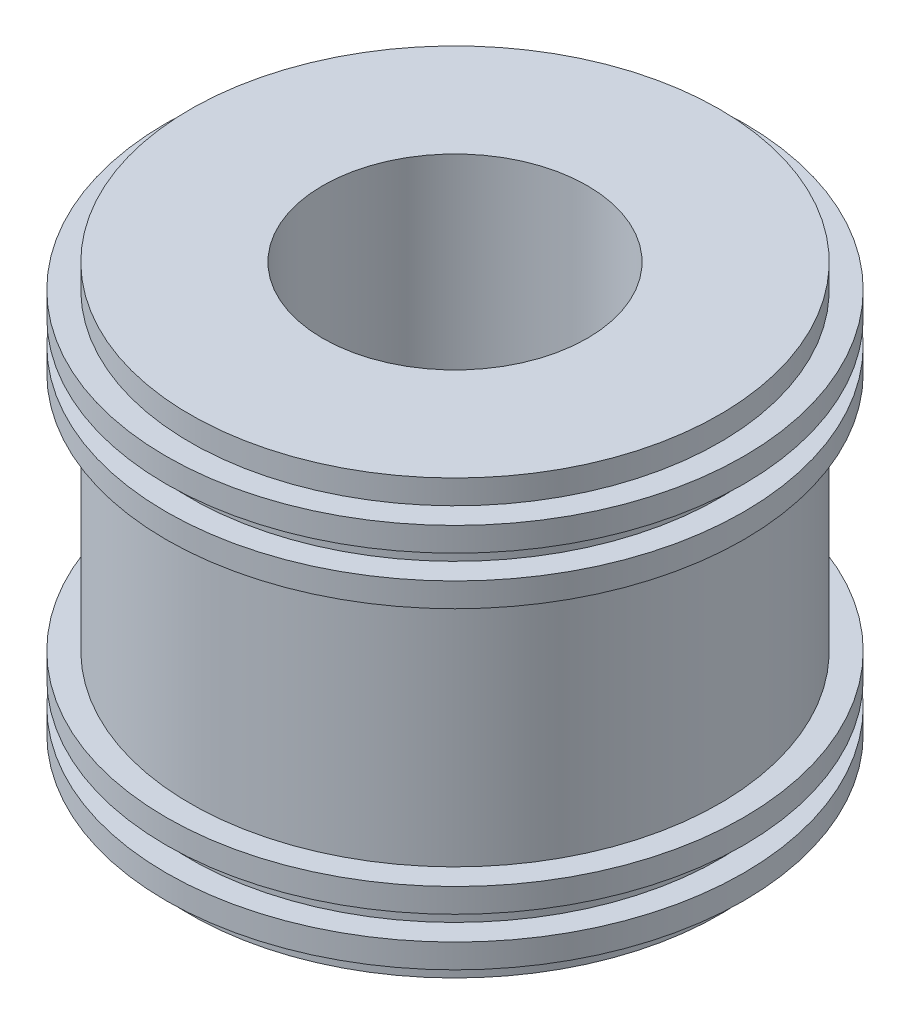
ISO-10303-21;
HEADER;
FILE_DESCRIPTION(('STEP AP214'),'2;1');
FILE_NAME('part.step','',(''),(''),'','','');
FILE_SCHEMA(('AUTOMOTIVE_DESIGN { 1 0 10303 214 1 1 1 1 }'));
ENDSEC;
DATA;
#1=APPLICATION_CONTEXT('core data for automotive mechanical design processes');
#2=APPLICATION_PROTOCOL_DEFINITION('international standard','automotive_design',2000,#1);
#3=PRODUCT_CONTEXT('',#1,'mechanical');
#4=PRODUCT('Part','Part','',(#3));
#5=PRODUCT_RELATED_PRODUCT_CATEGORY('part','',(#4));
#6=PRODUCT_DEFINITION_FORMATION('','',#4);
#7=PRODUCT_DEFINITION_CONTEXT('part definition',#1,'design');
#8=PRODUCT_DEFINITION('design','',#6,#7);
#9=PRODUCT_DEFINITION_SHAPE('','',#8);
#10=(LENGTH_UNIT() NAMED_UNIT(*) SI_UNIT(.MILLI.,.METRE.));
#11=(NAMED_UNIT(*) PLANE_ANGLE_UNIT() SI_UNIT($,.RADIAN.));
#12=(NAMED_UNIT(*) SI_UNIT($,.STERADIAN.) SOLID_ANGLE_UNIT());
#13=UNCERTAINTY_MEASURE_WITH_UNIT(LENGTH_MEASURE(1.E-05),#10,'distance_accuracy_value','');
#14=(GEOMETRIC_REPRESENTATION_CONTEXT(3) GLOBAL_UNCERTAINTY_ASSIGNED_CONTEXT((#13)) GLOBAL_UNIT_ASSIGNED_CONTEXT((#10,
#11,#12)) REPRESENTATION_CONTEXT('',''));
#15=CARTESIAN_POINT('',(0.,0.,0.));
#16=DIRECTION('',(0.,0.,1.));
#17=DIRECTION('',(1.,0.,0.));
#18=AXIS2_PLACEMENT_3D('',#15,#16,#17);
#19=CARTESIAN_POINT('',(24.,-16.,0.));
#20=DIRECTION('',(0.,-1.,0.));
#21=DIRECTION('',(0.,0.,-1.));
#22=AXIS2_PLACEMENT_3D('',#19,#20,#21);
#23=PLANE('',#22);
#24=CARTESIAN_POINT('',(0.,-16.,0.));
#25=DIRECTION('',(0.,-1.,0.));
#26=DIRECTION('',(0.,0.,-1.));
#27=AXIS2_PLACEMENT_3D('',#24,#25,#26);
#28=CIRCLE('',#27,24.);
#29=CARTESIAN_POINT('',(0.,-16.,-24.));
#30=VERTEX_POINT('',#29);
#31=EDGE_CURVE('E10',#30,#30,#28,.T.);
#32=ORIENTED_EDGE('',*,*,#31,.T.);
#33=EDGE_LOOP('',(#32));
#34=FACE_BOUND('',#33,.T.);
#35=CARTESIAN_POINT('',(0.,-16.,0.));
#36=DIRECTION('',(0.,-1.,0.));
#37=DIRECTION('',(0.,0.,-1.));
#38=AXIS2_PLACEMENT_3D('',#35,#36,#37);
#39=CIRCLE('',#38,22.);
#40=CARTESIAN_POINT('',(0.,-16.,-22.));
#41=VERTEX_POINT('',#40);
#42=EDGE_CURVE('E95',#41,#41,#39,.T.);
#43=ORIENTED_EDGE('',*,*,#42,.F.);
#44=EDGE_LOOP('',(#43));
#45=FACE_BOUND('',#44,.T.);
#46=ADVANCED_FACE('F31',(#34,#45),#23,.T.);
#47=CARTESIAN_POINT('',(0.,0.,0.));
#48=DIRECTION('',(0.,-1.,0.));
#49=DIRECTION('',(0.,0.,-1.));
#50=AXIS2_PLACEMENT_3D('',#47,#48,#49);
#51=CYLINDRICAL_SURFACE('',#50,24.);
#52=CARTESIAN_POINT('',(0.,-14.,0.));
#53=DIRECTION('',(0.,-1.,0.));
#54=DIRECTION('',(0.,0.,-1.));
#55=AXIS2_PLACEMENT_3D('',#52,#53,#54);
#56=CIRCLE('',#55,24.);
#57=CARTESIAN_POINT('',(0.,-14.,-24.));
#58=VERTEX_POINT('',#57);
#59=EDGE_CURVE('E37',#58,#58,#56,.T.);
#60=ORIENTED_EDGE('',*,*,#59,.T.);
#61=EDGE_LOOP('',(#60));
#62=FACE_BOUND('',#61,.T.);
#63=ORIENTED_EDGE('',*,*,#31,.F.);
#64=EDGE_LOOP('',(#63));
#65=FACE_BOUND('',#64,.T.);
#66=ADVANCED_FACE('F103',(#62,#65),#51,.T.);
#67=CARTESIAN_POINT('',(22.,-14.,0.));
#68=DIRECTION('',(0.,1.,0.));
#69=DIRECTION('',(0.,0.,1.));
#70=AXIS2_PLACEMENT_3D('',#67,#68,#69);
#71=PLANE('',#70);
#72=CARTESIAN_POINT('',(0.,-14.,0.));
#73=DIRECTION('',(0.,-1.,0.));
#74=DIRECTION('',(0.,0.,-1.));
#75=AXIS2_PLACEMENT_3D('',#72,#73,#74);
#76=CIRCLE('',#75,22.);
#77=CARTESIAN_POINT('',(0.,-14.,-22.));
#78=VERTEX_POINT('',#77);
#79=EDGE_CURVE('E41',#78,#78,#76,.T.);
#80=ORIENTED_EDGE('',*,*,#79,.T.);
#81=EDGE_LOOP('',(#80));
#82=FACE_BOUND('',#81,.T.);
#83=ORIENTED_EDGE('',*,*,#59,.F.);
#84=EDGE_LOOP('',(#83));
#85=FACE_BOUND('',#84,.T.);
#86=ADVANCED_FACE('F107',(#82,#85),#71,.T.);
#87=CARTESIAN_POINT('',(0.,0.,0.));
#88=DIRECTION('',(0.,-1.,0.));
#89=DIRECTION('',(0.,0.,-1.));
#90=AXIS2_PLACEMENT_3D('',#87,#88,#89);
#91=CYLINDRICAL_SURFACE('',#90,22.);
#92=CARTESIAN_POINT('',(0.,-12.,0.));
#93=DIRECTION('',(0.,-1.,0.));
#94=DIRECTION('',(0.,0.,-1.));
#95=AXIS2_PLACEMENT_3D('',#92,#93,#94);
#96=CIRCLE('',#95,22.);
#97=CARTESIAN_POINT('',(0.,-12.,-22.));
#98=VERTEX_POINT('',#97);
#99=EDGE_CURVE('E45',#98,#98,#96,.T.);
#100=ORIENTED_EDGE('',*,*,#99,.T.);
#101=EDGE_LOOP('',(#100));
#102=FACE_BOUND('',#101,.T.);
#103=ORIENTED_EDGE('',*,*,#79,.F.);
#104=EDGE_LOOP('',(#103));
#105=FACE_BOUND('',#104,.T.);
#106=ADVANCED_FACE('F111',(#102,#105),#91,.T.);
#107=CARTESIAN_POINT('',(22.,-12.,0.));
#108=DIRECTION('',(0.,-1.,0.));
#109=DIRECTION('',(0.,0.,-1.));
#110=AXIS2_PLACEMENT_3D('',#107,#108,#109);
#111=PLANE('',#110);
#112=CARTESIAN_POINT('',(0.,-12.,0.));
#113=DIRECTION('',(0.,-1.,0.));
#114=DIRECTION('',(0.,0.,-1.));
#115=AXIS2_PLACEMENT_3D('',#112,#113,#114);
#116=CIRCLE('',#115,24.);
#117=CARTESIAN_POINT('',(0.,-12.,-24.));
#118=VERTEX_POINT('',#117);
#119=EDGE_CURVE('E50',#118,#118,#116,.T.);
#120=ORIENTED_EDGE('',*,*,#119,.T.);
#121=EDGE_LOOP('',(#120));
#122=FACE_BOUND('',#121,.T.);
#123=ORIENTED_EDGE('',*,*,#99,.F.);
#124=EDGE_LOOP('',(#123));
#125=FACE_BOUND('',#124,.T.);
#126=ADVANCED_FACE('F118',(#122,#125),#111,.T.);
#127=CARTESIAN_POINT('',(0.,0.,0.));
#128=DIRECTION('',(0.,-1.,0.));
#129=DIRECTION('',(0.,0.,-1.));
#130=AXIS2_PLACEMENT_3D('',#127,#128,#129);
#131=CYLINDRICAL_SURFACE('',#130,24.);
#132=CARTESIAN_POINT('',(0.,-9.99999999999999,0.));
#133=DIRECTION('',(0.,-1.,0.));
#134=DIRECTION('',(0.,0.,-1.));
#135=AXIS2_PLACEMENT_3D('',#132,#133,#134);
#136=CIRCLE('',#135,24.);
#137=CARTESIAN_POINT('',(0.,-9.99999999999999,-24.));
#138=VERTEX_POINT('',#137);
#139=EDGE_CURVE('E53',#138,#138,#136,.T.);
#140=ORIENTED_EDGE('',*,*,#139,.T.);
#141=EDGE_LOOP('',(#140));
#142=FACE_BOUND('',#141,.T.);
#143=ORIENTED_EDGE('',*,*,#119,.F.);
#144=EDGE_LOOP('',(#143));
#145=FACE_BOUND('',#144,.T.);
#146=ADVANCED_FACE('F122',(#142,#145),#131,.T.);
#147=CARTESIAN_POINT('',(24.,-9.99999999999999,0.));
#148=DIRECTION('',(0.,1.,0.));
#149=DIRECTION('',(0.,0.,1.));
#150=AXIS2_PLACEMENT_3D('',#147,#148,#149);
#151=PLANE('',#150);
#152=CARTESIAN_POINT('',(0.,-9.99999999999999,0.));
#153=DIRECTION('',(0.,-1.,0.));
#154=DIRECTION('',(0.,0.,-1.));
#155=AXIS2_PLACEMENT_3D('',#152,#153,#154);
#156=CIRCLE('',#155,22.);
#157=CARTESIAN_POINT('',(0.,-9.99999999999999,-22.));
#158=VERTEX_POINT('',#157);
#159=EDGE_CURVE('E56',#158,#158,#156,.T.);
#160=ORIENTED_EDGE('',*,*,#159,.T.);
#161=EDGE_LOOP('',(#160));
#162=FACE_BOUND('',#161,.T.);
#163=ORIENTED_EDGE('',*,*,#139,.F.);
#164=EDGE_LOOP('',(#163));
#165=FACE_BOUND('',#164,.T.);
#166=ADVANCED_FACE('F126',(#162,#165),#151,.T.);
#167=CARTESIAN_POINT('',(0.,0.,0.));
#168=DIRECTION('',(0.,-1.,0.));
#169=DIRECTION('',(0.,0.,-1.));
#170=AXIS2_PLACEMENT_3D('',#167,#168,#169);
#171=CYLINDRICAL_SURFACE('',#170,22.);
#172=CARTESIAN_POINT('',(0.,9.99999999999999,0.));
#173=DIRECTION('',(0.,-1.,0.));
#174=DIRECTION('',(0.,0.,-1.));
#175=AXIS2_PLACEMENT_3D('',#172,#173,#174);
#176=CIRCLE('',#175,22.);
#177=CARTESIAN_POINT('',(0.,9.99999999999999,-22.));
#178=VERTEX_POINT('',#177);
#179=EDGE_CURVE('E59',#178,#178,#176,.T.);
#180=ORIENTED_EDGE('',*,*,#179,.T.);
#181=EDGE_LOOP('',(#180));
#182=FACE_BOUND('',#181,.T.);
#183=ORIENTED_EDGE('',*,*,#159,.F.);
#184=EDGE_LOOP('',(#183));
#185=FACE_BOUND('',#184,.T.);
#186=ADVANCED_FACE('F130',(#182,#185),#171,.T.);
#187=CARTESIAN_POINT('',(24.,9.99999999999999,0.));
#188=DIRECTION('',(0.,-1.,0.));
#189=DIRECTION('',(0.,0.,-1.));
#190=AXIS2_PLACEMENT_3D('',#187,#188,#189);
#191=PLANE('',#190);
#192=CARTESIAN_POINT('',(0.,9.99999999999999,0.));
#193=DIRECTION('',(0.,-1.,0.));
#194=DIRECTION('',(0.,0.,-1.));
#195=AXIS2_PLACEMENT_3D('',#192,#193,#194);
#196=CIRCLE('',#195,24.);
#197=CARTESIAN_POINT('',(0.,9.99999999999999,-24.));
#198=VERTEX_POINT('',#197);
#199=EDGE_CURVE('E62',#198,#198,#196,.T.);
#200=ORIENTED_EDGE('',*,*,#199,.T.);
#201=EDGE_LOOP('',(#200));
#202=FACE_BOUND('',#201,.T.);
#203=ORIENTED_EDGE('',*,*,#179,.F.);
#204=EDGE_LOOP('',(#203));
#205=FACE_BOUND('',#204,.T.);
#206=ADVANCED_FACE('F134',(#202,#205),#191,.T.);
#207=CARTESIAN_POINT('',(0.,0.,0.));
#208=DIRECTION('',(0.,-1.,0.));
#209=DIRECTION('',(0.,0.,-1.));
#210=AXIS2_PLACEMENT_3D('',#207,#208,#209);
#211=CYLINDRICAL_SURFACE('',#210,24.);
#212=CARTESIAN_POINT('',(0.,12.,0.));
#213=DIRECTION('',(0.,-1.,0.));
#214=DIRECTION('',(0.,0.,-1.));
#215=AXIS2_PLACEMENT_3D('',#212,#213,#214);
#216=CIRCLE('',#215,24.);
#217=CARTESIAN_POINT('',(0.,12.,-24.));
#218=VERTEX_POINT('',#217);
#219=EDGE_CURVE('E65',#218,#218,#216,.T.);
#220=ORIENTED_EDGE('',*,*,#219,.T.);
#221=EDGE_LOOP('',(#220));
#222=FACE_BOUND('',#221,.T.);
#223=ORIENTED_EDGE('',*,*,#199,.F.);
#224=EDGE_LOOP('',(#223));
#225=FACE_BOUND('',#224,.T.);
#226=ADVANCED_FACE('F138',(#222,#225),#211,.T.);
#227=CARTESIAN_POINT('',(22.,12.,0.));
#228=DIRECTION('',(0.,1.,0.));
#229=DIRECTION('',(0.,0.,1.));
#230=AXIS2_PLACEMENT_3D('',#227,#228,#229);
#231=PLANE('',#230);
#232=CARTESIAN_POINT('',(0.,12.,0.));
#233=DIRECTION('',(0.,-1.,0.));
#234=DIRECTION('',(0.,0.,-1.));
#235=AXIS2_PLACEMENT_3D('',#232,#233,#234);
#236=CIRCLE('',#235,22.);
#237=CARTESIAN_POINT('',(0.,12.,-22.));
#238=VERTEX_POINT('',#237);
#239=EDGE_CURVE('E68',#238,#238,#236,.T.);
#240=ORIENTED_EDGE('',*,*,#239,.T.);
#241=EDGE_LOOP('',(#240));
#242=FACE_BOUND('',#241,.T.);
#243=ORIENTED_EDGE('',*,*,#219,.F.);
#244=EDGE_LOOP('',(#243));
#245=FACE_BOUND('',#244,.T.);
#246=ADVANCED_FACE('F142',(#242,#245),#231,.T.);
#247=CARTESIAN_POINT('',(0.,0.,0.));
#248=DIRECTION('',(0.,-1.,0.));
#249=DIRECTION('',(0.,0.,-1.));
#250=AXIS2_PLACEMENT_3D('',#247,#248,#249);
#251=CYLINDRICAL_SURFACE('',#250,22.);
#252=CARTESIAN_POINT('',(0.,14.,0.));
#253=DIRECTION('',(0.,-1.,0.));
#254=DIRECTION('',(0.,0.,-1.));
#255=AXIS2_PLACEMENT_3D('',#252,#253,#254);
#256=CIRCLE('',#255,22.);
#257=CARTESIAN_POINT('',(0.,14.,-22.));
#258=VERTEX_POINT('',#257);
#259=EDGE_CURVE('E71',#258,#258,#256,.T.);
#260=ORIENTED_EDGE('',*,*,#259,.T.);
#261=EDGE_LOOP('',(#260));
#262=FACE_BOUND('',#261,.T.);
#263=ORIENTED_EDGE('',*,*,#239,.F.);
#264=EDGE_LOOP('',(#263));
#265=FACE_BOUND('',#264,.T.);
#266=ADVANCED_FACE('F146',(#262,#265),#251,.T.);
#267=CARTESIAN_POINT('',(22.,14.,0.));
#268=DIRECTION('',(0.,-1.,0.));
#269=DIRECTION('',(0.,0.,-1.));
#270=AXIS2_PLACEMENT_3D('',#267,#268,#269);
#271=PLANE('',#270);
#272=CARTESIAN_POINT('',(0.,14.,0.));
#273=DIRECTION('',(0.,-1.,0.));
#274=DIRECTION('',(0.,0.,-1.));
#275=AXIS2_PLACEMENT_3D('',#272,#273,#274);
#276=CIRCLE('',#275,24.);
#277=CARTESIAN_POINT('',(0.,14.,-24.));
#278=VERTEX_POINT('',#277);
#279=EDGE_CURVE('E74',#278,#278,#276,.T.);
#280=ORIENTED_EDGE('',*,*,#279,.T.);
#281=EDGE_LOOP('',(#280));
#282=FACE_BOUND('',#281,.T.);
#283=ORIENTED_EDGE('',*,*,#259,.F.);
#284=EDGE_LOOP('',(#283));
#285=FACE_BOUND('',#284,.T.);
#286=ADVANCED_FACE('F150',(#282,#285),#271,.T.);
#287=CARTESIAN_POINT('',(0.,0.,0.));
#288=DIRECTION('',(0.,-1.,0.));
#289=DIRECTION('',(0.,0.,-1.));
#290=AXIS2_PLACEMENT_3D('',#287,#288,#289);
#291=CYLINDRICAL_SURFACE('',#290,24.);
#292=CARTESIAN_POINT('',(0.,16.,0.));
#293=DIRECTION('',(0.,-1.,0.));
#294=DIRECTION('',(0.,0.,-1.));
#295=AXIS2_PLACEMENT_3D('',#292,#293,#294);
#296=CIRCLE('',#295,24.);
#297=CARTESIAN_POINT('',(0.,16.,-24.));
#298=VERTEX_POINT('',#297);
#299=EDGE_CURVE('E77',#298,#298,#296,.T.);
#300=ORIENTED_EDGE('',*,*,#299,.T.);
#301=EDGE_LOOP('',(#300));
#302=FACE_BOUND('',#301,.T.);
#303=ORIENTED_EDGE('',*,*,#279,.F.);
#304=EDGE_LOOP('',(#303));
#305=FACE_BOUND('',#304,.T.);
#306=ADVANCED_FACE('F154',(#302,#305),#291,.T.);
#307=CARTESIAN_POINT('',(24.,16.,0.));
#308=DIRECTION('',(0.,1.,0.));
#309=DIRECTION('',(0.,0.,1.));
#310=AXIS2_PLACEMENT_3D('',#307,#308,#309);
#311=PLANE('',#310);
#312=CARTESIAN_POINT('',(0.,16.,0.));
#313=DIRECTION('',(0.,-1.,0.));
#314=DIRECTION('',(0.,0.,-1.));
#315=AXIS2_PLACEMENT_3D('',#312,#313,#314);
#316=CIRCLE('',#315,22.);
#317=CARTESIAN_POINT('',(0.,16.,-22.));
#318=VERTEX_POINT('',#317);
#319=EDGE_CURVE('E80',#318,#318,#316,.T.);
#320=ORIENTED_EDGE('',*,*,#319,.T.);
#321=EDGE_LOOP('',(#320));
#322=FACE_BOUND('',#321,.T.);
#323=ORIENTED_EDGE('',*,*,#299,.F.);
#324=EDGE_LOOP('',(#323));
#325=FACE_BOUND('',#324,.T.);
#326=ADVANCED_FACE('F158',(#322,#325),#311,.T.);
#327=CARTESIAN_POINT('',(0.,0.,0.));
#328=DIRECTION('',(0.,-1.,0.));
#329=DIRECTION('',(0.,0.,-1.));
#330=AXIS2_PLACEMENT_3D('',#327,#328,#329);
#331=CYLINDRICAL_SURFACE('',#330,22.);
#332=CARTESIAN_POINT('',(0.,18.,0.));
#333=DIRECTION('',(0.,-1.,0.));
#334=DIRECTION('',(0.,0.,-1.));
#335=AXIS2_PLACEMENT_3D('',#332,#333,#334);
#336=CIRCLE('',#335,22.);
#337=CARTESIAN_POINT('',(0.,18.,-22.));
#338=VERTEX_POINT('',#337);
#339=EDGE_CURVE('E83',#338,#338,#336,.T.);
#340=ORIENTED_EDGE('',*,*,#339,.T.);
#341=EDGE_LOOP('',(#340));
#342=FACE_BOUND('',#341,.T.);
#343=ORIENTED_EDGE('',*,*,#319,.F.);
#344=EDGE_LOOP('',(#343));
#345=FACE_BOUND('',#344,.T.);
#346=ADVANCED_FACE('F162',(#342,#345),#331,.T.);
#347=CARTESIAN_POINT('',(22.,18.,0.));
#348=DIRECTION('',(0.,1.,0.));
#349=DIRECTION('',(0.,0.,1.));
#350=AXIS2_PLACEMENT_3D('',#347,#348,#349);
#351=PLANE('',#350);
#352=CARTESIAN_POINT('',(0.,18.,0.));
#353=DIRECTION('',(0.,-1.,0.));
#354=DIRECTION('',(0.,0.,-1.));
#355=AXIS2_PLACEMENT_3D('',#352,#353,#354);
#356=CIRCLE('',#355,11.);
#357=CARTESIAN_POINT('',(0.,18.,-11.));
#358=VERTEX_POINT('',#357);
#359=EDGE_CURVE('E86',#358,#358,#356,.T.);
#360=ORIENTED_EDGE('',*,*,#359,.T.);
#361=EDGE_LOOP('',(#360));
#362=FACE_BOUND('',#361,.T.);
#363=ORIENTED_EDGE('',*,*,#339,.F.);
#364=EDGE_LOOP('',(#363));
#365=FACE_BOUND('',#364,.T.);
#366=ADVANCED_FACE('F166',(#362,#365),#351,.T.);
#367=CARTESIAN_POINT('',(0.,0.,0.));
#368=DIRECTION('',(0.,-1.,0.));
#369=DIRECTION('',(0.,0.,-1.));
#370=AXIS2_PLACEMENT_3D('',#367,#368,#369);
#371=CYLINDRICAL_SURFACE('',#370,11.);
#372=CARTESIAN_POINT('',(0.,-18.,0.));
#373=DIRECTION('',(0.,-1.,0.));
#374=DIRECTION('',(0.,0.,-1.));
#375=AXIS2_PLACEMENT_3D('',#372,#373,#374);
#376=CIRCLE('',#375,11.);
#377=CARTESIAN_POINT('',(0.,-18.,-11.));
#378=VERTEX_POINT('',#377);
#379=EDGE_CURVE('E89',#378,#378,#376,.T.);
#380=ORIENTED_EDGE('',*,*,#379,.T.);
#381=EDGE_LOOP('',(#380));
#382=FACE_BOUND('',#381,.T.);
#383=ORIENTED_EDGE('',*,*,#359,.F.);
#384=EDGE_LOOP('',(#383));
#385=FACE_BOUND('',#384,.T.);
#386=ADVANCED_FACE('F170',(#382,#385),#371,.F.);
#387=CARTESIAN_POINT('',(22.,-18.,0.));
#388=DIRECTION('',(0.,-1.,0.));
#389=DIRECTION('',(0.,0.,-1.));
#390=AXIS2_PLACEMENT_3D('',#387,#388,#389);
#391=PLANE('',#390);
#392=CARTESIAN_POINT('',(0.,-18.,0.));
#393=DIRECTION('',(0.,-1.,0.));
#394=DIRECTION('',(0.,0.,-1.));
#395=AXIS2_PLACEMENT_3D('',#392,#393,#394);
#396=CIRCLE('',#395,22.);
#397=CARTESIAN_POINT('',(0.,-18.,-22.));
#398=VERTEX_POINT('',#397);
#399=EDGE_CURVE('E92',#398,#398,#396,.T.);
#400=ORIENTED_EDGE('',*,*,#399,.T.);
#401=EDGE_LOOP('',(#400));
#402=FACE_BOUND('',#401,.T.);
#403=ORIENTED_EDGE('',*,*,#379,.F.);
#404=EDGE_LOOP('',(#403));
#405=FACE_BOUND('',#404,.T.);
#406=ADVANCED_FACE('F174',(#402,#405),#391,.T.);
#407=CARTESIAN_POINT('',(0.,0.,0.));
#408=DIRECTION('',(0.,-1.,0.));
#409=DIRECTION('',(0.,0.,-1.));
#410=AXIS2_PLACEMENT_3D('',#407,#408,#409);
#411=CYLINDRICAL_SURFACE('',#410,22.);
#412=ORIENTED_EDGE('',*,*,#42,.T.);
#413=EDGE_LOOP('',(#412));
#414=FACE_BOUND('',#413,.T.);
#415=ORIENTED_EDGE('',*,*,#399,.F.);
#416=EDGE_LOOP('',(#415));
#417=FACE_BOUND('',#416,.T.);
#418=ADVANCED_FACE('F99',(#414,#417),#411,.T.);
#419=CLOSED_SHELL('',(#46,#66,#86,#106,#126,#146,#166,#186,#206,#226,#246,#266,#286,#306,#326,
#346,#366,#386,#406,#418));
#420=MANIFOLD_SOLID_BREP('B2',#419);
#421=ADVANCED_BREP_SHAPE_REPRESENTATION('',(#18,#420),#14);
#422=SHAPE_DEFINITION_REPRESENTATION(#9,#421);
ENDSEC;
END-ISO-10303-21;
